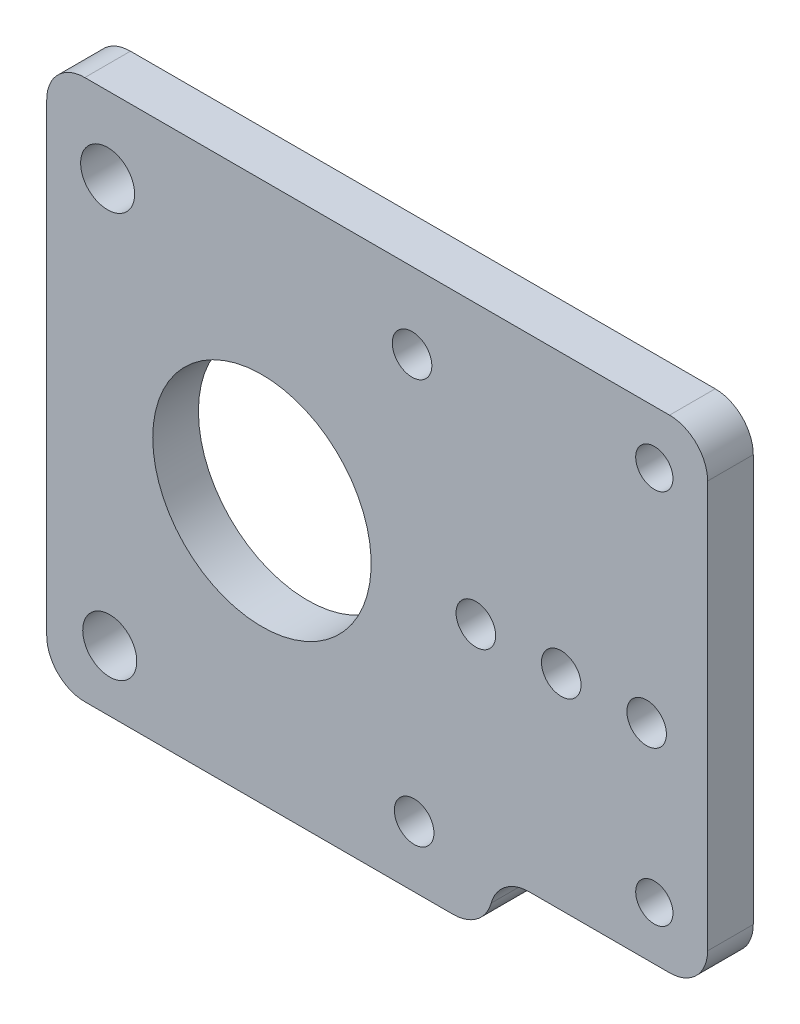
ISO-10303-21;
HEADER;
FILE_DESCRIPTION(('STEP AP214'),'2;1');
FILE_NAME('part.step','',(''),(''),'','','');
FILE_SCHEMA(('AUTOMOTIVE_DESIGN { 1 0 10303 214 1 1 1 1 }'));
ENDSEC;
DATA;
#1=APPLICATION_CONTEXT('core data for automotive mechanical design processes');
#2=APPLICATION_PROTOCOL_DEFINITION('international standard','automotive_design',2000,#1);
#3=PRODUCT_CONTEXT('',#1,'mechanical');
#4=PRODUCT('Part','Part','',(#3));
#5=PRODUCT_RELATED_PRODUCT_CATEGORY('part','',(#4));
#6=PRODUCT_DEFINITION_FORMATION('','',#4);
#7=PRODUCT_DEFINITION_CONTEXT('part definition',#1,'design');
#8=PRODUCT_DEFINITION('design','',#6,#7);
#9=PRODUCT_DEFINITION_SHAPE('','',#8);
#10=(LENGTH_UNIT() NAMED_UNIT(*) SI_UNIT(.MILLI.,.METRE.));
#11=(NAMED_UNIT(*) PLANE_ANGLE_UNIT() SI_UNIT($,.RADIAN.));
#12=(NAMED_UNIT(*) SI_UNIT($,.STERADIAN.) SOLID_ANGLE_UNIT());
#13=UNCERTAINTY_MEASURE_WITH_UNIT(LENGTH_MEASURE(1.E-05),#10,'distance_accuracy_value','');
#14=(GEOMETRIC_REPRESENTATION_CONTEXT(3) GLOBAL_UNCERTAINTY_ASSIGNED_CONTEXT((#13)) GLOBAL_UNIT_ASSIGNED_CONTEXT((#10,
#11,#12)) REPRESENTATION_CONTEXT('',''));
#15=CARTESIAN_POINT('',(0.,0.,0.));
#16=DIRECTION('',(0.,0.,1.));
#17=DIRECTION('',(1.,0.,0.));
#18=AXIS2_PLACEMENT_3D('',#15,#16,#17);
#19=CARTESIAN_POINT('',(-88.6401204237906,5.27683802928733,0.));
#20=DIRECTION('',(0.,0.,-1.));
#21=DIRECTION('',(-0.962462072065142,0.271416211446687,0.));
#22=AXIS2_PLACEMENT_3D('',#19,#20,#21);
#23=CYLINDRICAL_SURFACE('',#22,5.19500990752972);
#24=CARTESIAN_POINT('',(-88.6401204237906,5.27683802928733,0.));
#25=DIRECTION('',(0.,0.,-1.));
#26=DIRECTION('',(-0.962462072065142,0.271416211446688,0.));
#27=AXIS2_PLACEMENT_3D('',#24,#25,#26);
#28=CIRCLE('',#27,5.19500990752972);
#29=CARTESIAN_POINT('',(-93.6401204237906,6.68684793681706,0.));
#30=VERTEX_POINT('',#29);
#31=CARTESIAN_POINT('',(-88.6401204237906,10.4718479368171,0.));
#32=VERTEX_POINT('',#31);
#33=EDGE_CURVE('E278',#30,#32,#28,.T.);
#34=ORIENTED_EDGE('',*,*,#33,.T.);
#35=DIRECTION('',(0.,0.,1.));
#36=VECTOR('',#35,1.);
#37=CARTESIAN_POINT('',(-88.6401204237906,10.4718479368171,0.));
#38=LINE('',#37,#36);
#39=CARTESIAN_POINT('',(-88.6401204237906,10.4718479368171,6.));
#40=VERTEX_POINT('',#39);
#41=EDGE_CURVE('E11',#32,#40,#38,.T.);
#42=ORIENTED_EDGE('',*,*,#41,.T.);
#43=CARTESIAN_POINT('',(-88.6401204237906,5.27683802928733,6.));
#44=DIRECTION('',(0.,0.,-1.));
#45=DIRECTION('',(-0.962462072065142,0.271416211446688,0.));
#46=AXIS2_PLACEMENT_3D('',#43,#44,#45);
#47=CIRCLE('',#46,5.19500990752972);
#48=CARTESIAN_POINT('',(-93.6401204237906,6.68684793681706,6.));
#49=VERTEX_POINT('',#48);
#50=EDGE_CURVE('E257',#49,#40,#47,.T.);
#51=ORIENTED_EDGE('',*,*,#50,.F.);
#52=DIRECTION('',(0.,0.,1.));
#53=VECTOR('',#52,1.);
#54=CARTESIAN_POINT('',(-93.6401204237906,6.68684793681706,0.));
#55=LINE('',#54,#53);
#56=EDGE_CURVE('E273',#30,#49,#55,.T.);
#57=ORIENTED_EDGE('',*,*,#56,.F.);
#58=EDGE_LOOP('',(#34,#42,#51,#57));
#59=FACE_BOUND('',#58,.T.);
#60=ADVANCED_FACE('F16',(#59),#23,.F.);
#61=CARTESIAN_POINT('',(-88.6401204237906,10.4718479368171,0.));
#62=DIRECTION('',(0.,-1.,0.));
#63=DIRECTION('',(-1.,0.,0.));
#64=AXIS2_PLACEMENT_3D('',#61,#62,#63);
#65=PLANE('',#64);
#66=DIRECTION('',(1.,0.,0.));
#67=VECTOR('',#66,1.);
#68=CARTESIAN_POINT('',(-88.6401204237906,10.4718479368171,0.));
#69=LINE('',#68,#67);
#70=CARTESIAN_POINT('',(-70.2039629975671,10.4718479368171,0.));
#71=VERTEX_POINT('',#70);
#72=EDGE_CURVE('E275',#32,#71,#69,.T.);
#73=ORIENTED_EDGE('',*,*,#72,.T.);
#74=DIRECTION('',(0.,0.,1.));
#75=VECTOR('',#74,1.);
#76=CARTESIAN_POINT('',(-70.2039629975671,10.4718479368171,0.));
#77=LINE('',#76,#75);
#78=CARTESIAN_POINT('',(-70.2039629975671,10.4718479368171,6.));
#79=VERTEX_POINT('',#78);
#80=EDGE_CURVE('E27',#71,#79,#77,.T.);
#81=ORIENTED_EDGE('',*,*,#80,.T.);
#82=DIRECTION('',(1.,0.,0.));
#83=VECTOR('',#82,1.);
#84=CARTESIAN_POINT('',(-88.6401204237906,10.4718479368171,6.));
#85=LINE('',#84,#83);
#86=EDGE_CURVE('E260',#40,#79,#85,.T.);
#87=ORIENTED_EDGE('',*,*,#86,.F.);
#88=ORIENTED_EDGE('',*,*,#41,.F.);
#89=EDGE_LOOP('',(#73,#81,#87,#88));
#90=FACE_BOUND('',#89,.T.);
#91=ADVANCED_FACE('F450',(#90),#65,.T.);
#92=CARTESIAN_POINT('',(-70.2039629975671,15.4718479368171,0.));
#93=DIRECTION('',(0.,0.,1.));
#94=DIRECTION('',(0.,-1.,0.));
#95=AXIS2_PLACEMENT_3D('',#92,#93,#94);
#96=CYLINDRICAL_SURFACE('',#95,5.);
#97=CARTESIAN_POINT('',(-70.2039629975671,15.4718479368171,0.));
#98=DIRECTION('',(0.,0.,1.));
#99=DIRECTION('',(0.,-1.,0.));
#100=AXIS2_PLACEMENT_3D('',#97,#98,#99);
#101=CIRCLE('',#100,5.);
#102=CARTESIAN_POINT('',(-65.2039629975671,15.4718479368171,0.));
#103=VERTEX_POINT('',#102);
#104=EDGE_CURVE('E279',#71,#103,#101,.T.);
#105=ORIENTED_EDGE('',*,*,#104,.T.);
#106=DIRECTION('',(0.,0.,1.));
#107=VECTOR('',#106,1.);
#108=CARTESIAN_POINT('',(-65.2039629975671,15.4718479368171,0.));
#109=LINE('',#108,#107);
#110=CARTESIAN_POINT('',(-65.2039629975671,15.4718479368171,6.));
#111=VERTEX_POINT('',#110);
#112=EDGE_CURVE('E146',#103,#111,#109,.T.);
#113=ORIENTED_EDGE('',*,*,#112,.T.);
#114=CARTESIAN_POINT('',(-70.2039629975671,15.4718479368171,6.));
#115=DIRECTION('',(0.,0.,1.));
#116=DIRECTION('',(0.,-1.,0.));
#117=AXIS2_PLACEMENT_3D('',#114,#115,#116);
#118=CIRCLE('',#117,5.);
#119=EDGE_CURVE('E289',#79,#111,#118,.T.);
#120=ORIENTED_EDGE('',*,*,#119,.F.);
#121=ORIENTED_EDGE('',*,*,#80,.F.);
#122=EDGE_LOOP('',(#105,#113,#120,#121));
#123=FACE_BOUND('',#122,.T.);
#124=ADVANCED_FACE('F444',(#123),#96,.T.);
#125=CARTESIAN_POINT('',(-65.2039629975671,15.4718479368171,0.));
#126=DIRECTION('',(1.,0.,0.));
#127=DIRECTION('',(0.,-1.,0.));
#128=AXIS2_PLACEMENT_3D('',#125,#126,#127);
#129=PLANE('',#128);
#130=DIRECTION('',(0.,1.,0.));
#131=VECTOR('',#130,1.);
#132=CARTESIAN_POINT('',(-65.2039629975671,15.4718479368171,0.));
#133=LINE('',#132,#131);
#134=CARTESIAN_POINT('',(-65.2039629975671,68.9318479368171,0.));
#135=VERTEX_POINT('',#134);
#136=EDGE_CURVE('E20',#103,#135,#133,.T.);
#137=ORIENTED_EDGE('',*,*,#136,.T.);
#138=DIRECTION('',(0.,0.,1.));
#139=VECTOR('',#138,1.);
#140=CARTESIAN_POINT('',(-65.2039629975671,68.9318479368171,0.));
#141=LINE('',#140,#139);
#142=CARTESIAN_POINT('',(-65.2039629975671,68.9318479368171,6.));
#143=VERTEX_POINT('',#142);
#144=EDGE_CURVE('E134',#135,#143,#141,.T.);
#145=ORIENTED_EDGE('',*,*,#144,.T.);
#146=DIRECTION('',(0.,1.,0.));
#147=VECTOR('',#146,1.);
#148=CARTESIAN_POINT('',(-65.2039629975671,15.4718479368171,6.));
#149=LINE('',#148,#147);
#150=EDGE_CURVE('E285',#111,#143,#149,.T.);
#151=ORIENTED_EDGE('',*,*,#150,.F.);
#152=ORIENTED_EDGE('',*,*,#112,.F.);
#153=EDGE_LOOP('',(#137,#145,#151,#152));
#154=FACE_BOUND('',#153,.T.);
#155=ADVANCED_FACE('F449',(#154),#129,.T.);
#156=CARTESIAN_POINT('',(-70.2039629975671,68.9318479368171,0.));
#157=DIRECTION('',(0.,0.,1.));
#158=DIRECTION('',(1.,0.,0.));
#159=AXIS2_PLACEMENT_3D('',#156,#157,#158);
#160=CYLINDRICAL_SURFACE('',#159,5.);
#161=CARTESIAN_POINT('',(-70.2039629975671,68.9318479368171,0.));
#162=DIRECTION('',(0.,0.,1.));
#163=DIRECTION('',(1.,0.,0.));
#164=AXIS2_PLACEMENT_3D('',#161,#162,#163);
#165=CIRCLE('',#164,5.);
#166=CARTESIAN_POINT('',(-70.2039629975671,73.9318479368171,0.));
#167=VERTEX_POINT('',#166);
#168=EDGE_CURVE('E328',#135,#167,#165,.T.);
#169=ORIENTED_EDGE('',*,*,#168,.T.);
#170=DIRECTION('',(0.,0.,1.));
#171=VECTOR('',#170,1.);
#172=CARTESIAN_POINT('',(-70.2039629975671,73.9318479368171,0.));
#173=LINE('',#172,#171);
#174=CARTESIAN_POINT('',(-70.2039629975671,73.9318479368171,6.));
#175=VERTEX_POINT('',#174);
#176=EDGE_CURVE('E265',#167,#175,#173,.T.);
#177=ORIENTED_EDGE('',*,*,#176,.T.);
#178=CARTESIAN_POINT('',(-70.2039629975671,68.9318479368171,6.));
#179=DIRECTION('',(0.,0.,1.));
#180=DIRECTION('',(1.,0.,0.));
#181=AXIS2_PLACEMENT_3D('',#178,#179,#180);
#182=CIRCLE('',#181,5.);
#183=EDGE_CURVE('E288',#143,#175,#182,.T.);
#184=ORIENTED_EDGE('',*,*,#183,.F.);
#185=ORIENTED_EDGE('',*,*,#144,.F.);
#186=EDGE_LOOP('',(#169,#177,#184,#185));
#187=FACE_BOUND('',#186,.T.);
#188=ADVANCED_FACE('F496',(#187),#160,.T.);
#189=CARTESIAN_POINT('',(-70.2039629975671,73.9318479368171,0.));
#190=DIRECTION('',(0.,1.,0.));
#191=DIRECTION('',(1.,0.,0.));
#192=AXIS2_PLACEMENT_3D('',#189,#190,#191);
#193=PLANE('',#192);
#194=DIRECTION('',(-1.,0.,0.));
#195=VECTOR('',#194,1.);
#196=CARTESIAN_POINT('',(-70.2039629975671,73.9318479368171,0.));
#197=LINE('',#196,#195);
#198=CARTESIAN_POINT('',(-147.037894963746,73.9318479368171,0.));
#199=VERTEX_POINT('',#198);
#200=EDGE_CURVE('E332',#167,#199,#197,.T.);
#201=ORIENTED_EDGE('',*,*,#200,.T.);
#202=DIRECTION('',(0.,0.,1.));
#203=VECTOR('',#202,1.);
#204=CARTESIAN_POINT('',(-147.037894963746,73.9318479368171,0.));
#205=LINE('',#204,#203);
#206=CARTESIAN_POINT('',(-147.037894963746,73.9318479368171,6.));
#207=VERTEX_POINT('',#206);
#208=EDGE_CURVE('E262',#199,#207,#205,.T.);
#209=ORIENTED_EDGE('',*,*,#208,.T.);
#210=DIRECTION('',(-1.,0.,0.));
#211=VECTOR('',#210,1.);
#212=CARTESIAN_POINT('',(-70.2039629975671,73.9318479368171,6.));
#213=LINE('',#212,#211);
#214=EDGE_CURVE('E235',#175,#207,#213,.T.);
#215=ORIENTED_EDGE('',*,*,#214,.F.);
#216=ORIENTED_EDGE('',*,*,#176,.F.);
#217=EDGE_LOOP('',(#201,#209,#215,#216));
#218=FACE_BOUND('',#217,.T.);
#219=ADVANCED_FACE('F18',(#218),#193,.T.);
#220=CARTESIAN_POINT('',(-147.037894963746,68.9318479368171,0.));
#221=DIRECTION('',(0.,0.,1.));
#222=DIRECTION('',(0.,1.,0.));
#223=AXIS2_PLACEMENT_3D('',#220,#221,#222);
#224=CYLINDRICAL_SURFACE('',#223,5.);
#225=CARTESIAN_POINT('',(-147.037894963746,68.9318479368171,0.));
#226=DIRECTION('',(0.,0.,1.));
#227=DIRECTION('',(0.,1.,0.));
#228=AXIS2_PLACEMENT_3D('',#225,#226,#227);
#229=CIRCLE('',#228,5.);
#230=CARTESIAN_POINT('',(-152.037894963746,68.9318479368171,0.));
#231=VERTEX_POINT('',#230);
#232=EDGE_CURVE('E313',#199,#231,#229,.T.);
#233=ORIENTED_EDGE('',*,*,#232,.T.);
#234=DIRECTION('',(0.,0.,1.));
#235=VECTOR('',#234,1.);
#236=CARTESIAN_POINT('',(-152.037894963746,68.9318479368171,0.));
#237=LINE('',#236,#235);
#238=CARTESIAN_POINT('',(-152.037894963746,68.9318479368171,6.));
#239=VERTEX_POINT('',#238);
#240=EDGE_CURVE('E212',#231,#239,#237,.T.);
#241=ORIENTED_EDGE('',*,*,#240,.T.);
#242=CARTESIAN_POINT('',(-147.037894963746,68.9318479368171,6.));
#243=DIRECTION('',(0.,0.,1.));
#244=DIRECTION('',(0.,1.,0.));
#245=AXIS2_PLACEMENT_3D('',#242,#243,#244);
#246=CIRCLE('',#245,5.);
#247=EDGE_CURVE('E228',#207,#239,#246,.T.);
#248=ORIENTED_EDGE('',*,*,#247,.F.);
#249=ORIENTED_EDGE('',*,*,#208,.F.);
#250=EDGE_LOOP('',(#233,#241,#248,#249));
#251=FACE_BOUND('',#250,.T.);
#252=ADVANCED_FACE('F563',(#251),#224,.T.);
#253=CARTESIAN_POINT('',(-152.037894963746,68.9318479368171,0.));
#254=DIRECTION('',(-1.,0.,0.));
#255=DIRECTION('',(0.,0.,1.));
#256=AXIS2_PLACEMENT_3D('',#253,#254,#255);
#257=PLANE('',#256);
#258=DIRECTION('',(0.,-1.,0.));
#259=VECTOR('',#258,1.);
#260=CARTESIAN_POINT('',(-152.037894963746,68.9318479368171,0.));
#261=LINE('',#260,#259);
#262=CARTESIAN_POINT('',(-152.037894963746,7.90184793681706,0.));
#263=VERTEX_POINT('',#262);
#264=EDGE_CURVE('E207',#231,#263,#261,.T.);
#265=ORIENTED_EDGE('',*,*,#264,.T.);
#266=DIRECTION('',(0.,0.,1.));
#267=VECTOR('',#266,1.);
#268=CARTESIAN_POINT('',(-152.037894963746,7.90184793681706,0.));
#269=LINE('',#268,#267);
#270=CARTESIAN_POINT('',(-152.037894963746,7.90184793681706,6.));
#271=VERTEX_POINT('',#270);
#272=EDGE_CURVE('E200',#263,#271,#269,.T.);
#273=ORIENTED_EDGE('',*,*,#272,.T.);
#274=DIRECTION('',(0.,-1.,0.));
#275=VECTOR('',#274,1.);
#276=CARTESIAN_POINT('',(-152.037894963746,68.9318479368171,6.));
#277=LINE('',#276,#275);
#278=EDGE_CURVE('E204',#239,#271,#277,.T.);
#279=ORIENTED_EDGE('',*,*,#278,.F.);
#280=ORIENTED_EDGE('',*,*,#240,.F.);
#281=EDGE_LOOP('',(#265,#273,#279,#280));
#282=FACE_BOUND('',#281,.T.);
#283=ADVANCED_FACE('F202',(#282),#257,.T.);
#284=CARTESIAN_POINT('',(-147.037894963746,7.90184793681707,0.));
#285=DIRECTION('',(0.,0.,1.));
#286=DIRECTION('',(-1.,0.,0.));
#287=AXIS2_PLACEMENT_3D('',#284,#285,#286);
#288=CYLINDRICAL_SURFACE('',#287,5.);
#289=CARTESIAN_POINT('',(-147.037894963746,7.90184793681707,0.));
#290=DIRECTION('',(0.,0.,1.));
#291=DIRECTION('',(-1.,0.,0.));
#292=AXIS2_PLACEMENT_3D('',#289,#290,#291);
#293=CIRCLE('',#292,5.);
#294=CARTESIAN_POINT('',(-147.037894963746,2.90184793681706,0.));
#295=VERTEX_POINT('',#294);
#296=EDGE_CURVE('E249',#263,#295,#293,.T.);
#297=ORIENTED_EDGE('',*,*,#296,.T.);
#298=DIRECTION('',(0.,0.,1.));
#299=VECTOR('',#298,1.);
#300=CARTESIAN_POINT('',(-147.037894963746,2.90184793681706,0.));
#301=LINE('',#300,#299);
#302=CARTESIAN_POINT('',(-147.037894963746,2.90184793681706,6.));
#303=VERTEX_POINT('',#302);
#304=EDGE_CURVE('E213',#295,#303,#301,.T.);
#305=ORIENTED_EDGE('',*,*,#304,.T.);
#306=CARTESIAN_POINT('',(-147.037894963746,7.90184793681707,6.));
#307=DIRECTION('',(0.,0.,1.));
#308=DIRECTION('',(-1.,0.,0.));
#309=AXIS2_PLACEMENT_3D('',#306,#307,#308);
#310=CIRCLE('',#309,5.);
#311=EDGE_CURVE('E216',#271,#303,#310,.T.);
#312=ORIENTED_EDGE('',*,*,#311,.F.);
#313=ORIENTED_EDGE('',*,*,#272,.F.);
#314=EDGE_LOOP('',(#297,#305,#312,#313));
#315=FACE_BOUND('',#314,.T.);
#316=ADVANCED_FACE('F217',(#315),#288,.T.);
#317=CARTESIAN_POINT('',(-147.037894963746,2.90184793681706,0.));
#318=DIRECTION('',(0.,-1.,0.));
#319=DIRECTION('',(-1.,0.,0.));
#320=AXIS2_PLACEMENT_3D('',#317,#318,#319);
#321=PLANE('',#320);
#322=DIRECTION('',(1.,0.,0.));
#323=VECTOR('',#322,1.);
#324=CARTESIAN_POINT('',(-147.037894963746,2.90184793681706,0.));
#325=LINE('',#324,#323);
#326=CARTESIAN_POINT('',(-98.6401204237907,2.90184793681706,0.));
#327=VERTEX_POINT('',#326);
#328=EDGE_CURVE('E245',#295,#327,#325,.T.);
#329=ORIENTED_EDGE('',*,*,#328,.T.);
#330=DIRECTION('',(0.,0.,1.));
#331=VECTOR('',#330,1.);
#332=CARTESIAN_POINT('',(-98.6401204237907,2.90184793681706,0.));
#333=LINE('',#332,#331);
#334=CARTESIAN_POINT('',(-98.6401204237907,2.90184793681706,6.));
#335=VERTEX_POINT('',#334);
#336=EDGE_CURVE('E366',#327,#335,#333,.T.);
#337=ORIENTED_EDGE('',*,*,#336,.T.);
#338=DIRECTION('',(1.,0.,0.));
#339=VECTOR('',#338,1.);
#340=CARTESIAN_POINT('',(-147.037894963746,2.90184793681706,6.));
#341=LINE('',#340,#339);
#342=EDGE_CURVE('E222',#303,#335,#341,.T.);
#343=ORIENTED_EDGE('',*,*,#342,.F.);
#344=ORIENTED_EDGE('',*,*,#304,.F.);
#345=EDGE_LOOP('',(#329,#337,#343,#344));
#346=FACE_BOUND('',#345,.T.);
#347=ADVANCED_FACE('F532',(#346),#321,.T.);
#348=CARTESIAN_POINT('',(-98.6401204237907,8.0968578443468,0.));
#349=DIRECTION('',(0.,0.,1.));
#350=DIRECTION('',(0.,-1.,0.));
#351=AXIS2_PLACEMENT_3D('',#348,#349,#350);
#352=CYLINDRICAL_SURFACE('',#351,5.19500990752974);
#353=CARTESIAN_POINT('',(-98.6401204237907,8.0968578443468,0.));
#354=DIRECTION('',(0.,0.,1.));
#355=DIRECTION('',(0.,-1.,0.));
#356=AXIS2_PLACEMENT_3D('',#353,#354,#355);
#357=CIRCLE('',#356,5.19500990752974);
#358=EDGE_CURVE('E250',#327,#30,#357,.T.);
#359=ORIENTED_EDGE('',*,*,#358,.T.);
#360=ORIENTED_EDGE('',*,*,#56,.T.);
#361=CARTESIAN_POINT('',(-98.6401204237907,8.0968578443468,6.));
#362=DIRECTION('',(0.,0.,1.));
#363=DIRECTION('',(0.,-1.,0.));
#364=AXIS2_PLACEMENT_3D('',#361,#362,#363);
#365=CIRCLE('',#364,5.19500990752974);
#366=EDGE_CURVE('E270',#335,#49,#365,.T.);
#367=ORIENTED_EDGE('',*,*,#366,.F.);
#368=ORIENTED_EDGE('',*,*,#336,.F.);
#369=EDGE_LOOP('',(#359,#360,#367,#368));
#370=FACE_BOUND('',#369,.T.);
#371=ADVANCED_FACE('F526',(#370),#352,.T.);
#372=CARTESIAN_POINT('',(-123.760120423791,37.4218479368171,0.));
#373=DIRECTION('',(0.,0.,1.));
#374=DIRECTION('',(-1.,0.,0.));
#375=AXIS2_PLACEMENT_3D('',#372,#373,#374);
#376=CYLINDRICAL_SURFACE('',#375,14.35);
#377=CARTESIAN_POINT('',(-123.760120423791,37.4218479368171,6.));
#378=DIRECTION('',(0.,0.,-1.));
#379=DIRECTION('',(-1.,0.,0.));
#380=AXIS2_PLACEMENT_3D('',#377,#378,#379);
#381=CIRCLE('',#380,14.35);
#382=CARTESIAN_POINT('',(-138.110120423791,37.4218479368171,6.));
#383=VERTEX_POINT('',#382);
#384=EDGE_CURVE('E307',#383,#383,#381,.T.);
#385=ORIENTED_EDGE('',*,*,#384,.F.);
#386=EDGE_LOOP('',(#385));
#387=FACE_BOUND('',#386,.T.);
#388=CARTESIAN_POINT('',(-123.760120423791,37.4218479368171,0.));
#389=DIRECTION('',(0.,0.,1.));
#390=DIRECTION('',(-1.,0.,0.));
#391=AXIS2_PLACEMENT_3D('',#388,#389,#390);
#392=CIRCLE('',#391,14.35);
#393=CARTESIAN_POINT('',(-138.110120423791,37.4218479368171,0.));
#394=VERTEX_POINT('',#393);
#395=EDGE_CURVE('E284',#394,#394,#392,.T.);
#396=ORIENTED_EDGE('',*,*,#395,.F.);
#397=EDGE_LOOP('',(#396));
#398=FACE_BOUND('',#397,.T.);
#399=ADVANCED_FACE('F531',(#387,#398),#376,.F.);
#400=CARTESIAN_POINT('',(-143.760120423791,10.9018479368171,0.));
#401=DIRECTION('',(0.,0.,1.));
#402=DIRECTION('',(-1.,0.,0.));
#403=AXIS2_PLACEMENT_3D('',#400,#401,#402);
#404=CYLINDRICAL_SURFACE('',#403,3.55);
#405=CARTESIAN_POINT('',(-143.760120423791,10.9018479368171,6.));
#406=DIRECTION('',(0.,0.,-1.));
#407=DIRECTION('',(-1.,0.,0.));
#408=AXIS2_PLACEMENT_3D('',#405,#406,#407);
#409=CIRCLE('',#408,3.55);
#410=CARTESIAN_POINT('',(-147.310120423791,10.9018479368171,6.));
#411=VERTEX_POINT('',#410);
#412=EDGE_CURVE('E310',#411,#411,#409,.T.);
#413=ORIENTED_EDGE('',*,*,#412,.F.);
#414=EDGE_LOOP('',(#413));
#415=FACE_BOUND('',#414,.T.);
#416=CARTESIAN_POINT('',(-143.760120423791,10.9018479368171,0.));
#417=DIRECTION('',(0.,0.,1.));
#418=DIRECTION('',(-1.,0.,0.));
#419=AXIS2_PLACEMENT_3D('',#416,#417,#418);
#420=CIRCLE('',#419,3.55);
#421=CARTESIAN_POINT('',(-147.310120423791,10.9018479368171,0.));
#422=VERTEX_POINT('',#421);
#423=EDGE_CURVE('E301',#422,#422,#420,.T.);
#424=ORIENTED_EDGE('',*,*,#423,.F.);
#425=EDGE_LOOP('',(#424));
#426=FACE_BOUND('',#425,.T.);
#427=ADVANCED_FACE('F542',(#415,#426),#404,.F.);
#428=CARTESIAN_POINT('',(-144.037894963746,63.9312892910639,0.));
#429=DIRECTION('',(0.,0.,1.));
#430=DIRECTION('',(-1.,0.,0.));
#431=AXIS2_PLACEMENT_3D('',#428,#429,#430);
#432=CYLINDRICAL_SURFACE('',#431,3.55);
#433=CARTESIAN_POINT('',(-144.037894963746,63.9312892910639,6.));
#434=DIRECTION('',(0.,0.,-1.));
#435=DIRECTION('',(-1.,0.,0.));
#436=AXIS2_PLACEMENT_3D('',#433,#434,#435);
#437=CIRCLE('',#436,3.55);
#438=CARTESIAN_POINT('',(-147.587894963746,63.9312892910639,6.));
#439=VERTEX_POINT('',#438);
#440=EDGE_CURVE('E321',#439,#439,#437,.T.);
#441=ORIENTED_EDGE('',*,*,#440,.F.);
#442=EDGE_LOOP('',(#441));
#443=FACE_BOUND('',#442,.T.);
#444=CARTESIAN_POINT('',(-144.037894963746,63.9312892910639,0.));
#445=DIRECTION('',(0.,0.,1.));
#446=DIRECTION('',(-1.,0.,0.));
#447=AXIS2_PLACEMENT_3D('',#444,#445,#446);
#448=CIRCLE('',#447,3.55);
#449=CARTESIAN_POINT('',(-147.587894963746,63.9312892910639,0.));
#450=VERTEX_POINT('',#449);
#451=EDGE_CURVE('E306',#450,#450,#448,.T.);
#452=ORIENTED_EDGE('',*,*,#451,.F.);
#453=EDGE_LOOP('',(#452));
#454=FACE_BOUND('',#453,.T.);
#455=ADVANCED_FACE('F478',(#443,#454),#432,.F.);
#456=CARTESIAN_POINT('',(-95.6539629975671,37.4112892910639,0.));
#457=DIRECTION('',(0.,0.,1.));
#458=DIRECTION('',(-1.,0.,0.));
#459=AXIS2_PLACEMENT_3D('',#456,#457,#458);
#460=CYLINDRICAL_SURFACE('',#459,2.6);
#461=CARTESIAN_POINT('',(-95.6539629975671,37.4112892910639,6.));
#462=DIRECTION('',(0.,0.,-1.));
#463=DIRECTION('',(-1.,0.,0.));
#464=AXIS2_PLACEMENT_3D('',#461,#462,#463);
#465=CIRCLE('',#464,2.6);
#466=CARTESIAN_POINT('',(-98.2539629975671,37.4112892910639,6.));
#467=VERTEX_POINT('',#466);
#468=EDGE_CURVE('E244',#467,#467,#465,.T.);
#469=ORIENTED_EDGE('',*,*,#468,.F.);
#470=EDGE_LOOP('',(#469));
#471=FACE_BOUND('',#470,.T.);
#472=CARTESIAN_POINT('',(-95.6539629975671,37.4112892910639,0.));
#473=DIRECTION('',(0.,0.,1.));
#474=DIRECTION('',(-1.,0.,0.));
#475=AXIS2_PLACEMENT_3D('',#472,#473,#474);
#476=CIRCLE('',#475,2.6);
#477=CARTESIAN_POINT('',(-98.2539629975671,37.4112892910639,0.));
#478=VERTEX_POINT('',#477);
#479=EDGE_CURVE('E256',#478,#478,#476,.T.);
#480=ORIENTED_EDGE('',*,*,#479,.F.);
#481=EDGE_LOOP('',(#480));
#482=FACE_BOUND('',#481,.T.);
#483=ADVANCED_FACE('F472',(#471,#482),#460,.F.);
#484=CARTESIAN_POINT('',(-84.4339629975671,37.4112892910639,0.));
#485=DIRECTION('',(0.,0.,1.));
#486=DIRECTION('',(-1.,0.,0.));
#487=AXIS2_PLACEMENT_3D('',#484,#485,#486);
#488=CYLINDRICAL_SURFACE('',#487,2.6);
#489=CARTESIAN_POINT('',(-84.4339629975671,37.4112892910639,6.));
#490=DIRECTION('',(0.,0.,-1.));
#491=DIRECTION('',(-1.,0.,0.));
#492=AXIS2_PLACEMENT_3D('',#489,#490,#491);
#493=CIRCLE('',#492,2.6);
#494=CARTESIAN_POINT('',(-87.0339629975671,37.4112892910639,6.));
#495=VERTEX_POINT('',#494);
#496=EDGE_CURVE('E240',#495,#495,#493,.T.);
#497=ORIENTED_EDGE('',*,*,#496,.F.);
#498=EDGE_LOOP('',(#497));
#499=FACE_BOUND('',#498,.T.);
#500=CARTESIAN_POINT('',(-84.4339629975671,37.4112892910639,0.));
#501=DIRECTION('',(0.,0.,1.));
#502=DIRECTION('',(-1.,0.,0.));
#503=AXIS2_PLACEMENT_3D('',#500,#501,#502);
#504=CIRCLE('',#503,2.6);
#505=CARTESIAN_POINT('',(-87.0339629975671,37.4112892910639,0.));
#506=VERTEX_POINT('',#505);
#507=EDGE_CURVE('E251',#506,#506,#504,.T.);
#508=ORIENTED_EDGE('',*,*,#507,.F.);
#509=EDGE_LOOP('',(#508));
#510=FACE_BOUND('',#509,.T.);
#511=ADVANCED_FACE('F477',(#499,#510),#488,.F.);
#512=CARTESIAN_POINT('',(-73.2139629975671,37.4112892910639,0.));
#513=DIRECTION('',(0.,0.,1.));
#514=DIRECTION('',(-1.,0.,0.));
#515=AXIS2_PLACEMENT_3D('',#512,#513,#514);
#516=CYLINDRICAL_SURFACE('',#515,2.6);
#517=CARTESIAN_POINT('',(-73.2139629975671,37.4112892910639,6.));
#518=DIRECTION('',(0.,0.,-1.));
#519=DIRECTION('',(-1.,0.,0.));
#520=AXIS2_PLACEMENT_3D('',#517,#518,#519);
#521=CIRCLE('',#520,2.6);
#522=CARTESIAN_POINT('',(-75.8139629975671,37.4112892910639,6.));
#523=VERTEX_POINT('',#522);
#524=EDGE_CURVE('E243',#523,#523,#521,.T.);
#525=ORIENTED_EDGE('',*,*,#524,.F.);
#526=EDGE_LOOP('',(#525));
#527=FACE_BOUND('',#526,.T.);
#528=CARTESIAN_POINT('',(-73.2139629975671,37.4112892910639,0.));
#529=DIRECTION('',(0.,0.,1.));
#530=DIRECTION('',(-1.,0.,0.));
#531=AXIS2_PLACEMENT_3D('',#528,#529,#530);
#532=CIRCLE('',#531,2.6);
#533=CARTESIAN_POINT('',(-75.8139629975671,37.4112892910639,0.));
#534=VERTEX_POINT('',#533);
#535=EDGE_CURVE('E255',#534,#534,#532,.T.);
#536=ORIENTED_EDGE('',*,*,#535,.F.);
#537=EDGE_LOOP('',(#536));
#538=FACE_BOUND('',#537,.T.);
#539=ADVANCED_FACE('F490',(#527,#538),#516,.F.);
#540=CARTESIAN_POINT('',(-103.760120423791,10.9018479368171,0.));
#541=DIRECTION('',(0.,0.,1.));
#542=DIRECTION('',(-1.,0.,0.));
#543=AXIS2_PLACEMENT_3D('',#540,#541,#542);
#544=CYLINDRICAL_SURFACE('',#543,2.6);
#545=CARTESIAN_POINT('',(-103.760120423791,10.9018479368171,6.));
#546=DIRECTION('',(0.,0.,-1.));
#547=DIRECTION('',(-1.,0.,0.));
#548=AXIS2_PLACEMENT_3D('',#545,#546,#547);
#549=CIRCLE('',#548,2.6);
#550=CARTESIAN_POINT('',(-106.360120423791,10.9018479368171,6.));
#551=VERTEX_POINT('',#550);
#552=EDGE_CURVE('E325',#551,#551,#549,.T.);
#553=ORIENTED_EDGE('',*,*,#552,.F.);
#554=EDGE_LOOP('',(#553));
#555=FACE_BOUND('',#554,.T.);
#556=CARTESIAN_POINT('',(-103.760120423791,10.9018479368171,0.));
#557=DIRECTION('',(0.,0.,1.));
#558=DIRECTION('',(-1.,0.,0.));
#559=AXIS2_PLACEMENT_3D('',#556,#557,#558);
#560=CIRCLE('',#559,2.6);
#561=CARTESIAN_POINT('',(-106.360120423791,10.9018479368171,0.));
#562=VERTEX_POINT('',#561);
#563=EDGE_CURVE('E295',#562,#562,#560,.T.);
#564=ORIENTED_EDGE('',*,*,#563,.F.);
#565=EDGE_LOOP('',(#564));
#566=FACE_BOUND('',#565,.T.);
#567=ADVANCED_FACE('F485',(#555,#566),#544,.F.);
#568=CARTESIAN_POINT('',(-104.037894963746,63.9312892910639,0.));
#569=DIRECTION('',(0.,0.,1.));
#570=DIRECTION('',(-1.,0.,0.));
#571=AXIS2_PLACEMENT_3D('',#568,#569,#570);
#572=CYLINDRICAL_SURFACE('',#571,2.6);
#573=CARTESIAN_POINT('',(-104.037894963746,63.9312892910639,6.));
#574=DIRECTION('',(0.,0.,-1.));
#575=DIRECTION('',(-1.,0.,0.));
#576=AXIS2_PLACEMENT_3D('',#573,#574,#575);
#577=CIRCLE('',#576,2.6);
#578=CARTESIAN_POINT('',(-106.637894963746,63.9312892910639,6.));
#579=VERTEX_POINT('',#578);
#580=EDGE_CURVE('E340',#579,#579,#577,.T.);
#581=ORIENTED_EDGE('',*,*,#580,.F.);
#582=EDGE_LOOP('',(#581));
#583=FACE_BOUND('',#582,.T.);
#584=CARTESIAN_POINT('',(-104.037894963746,63.9312892910639,0.));
#585=DIRECTION('',(0.,0.,1.));
#586=DIRECTION('',(-1.,0.,0.));
#587=AXIS2_PLACEMENT_3D('',#584,#585,#586);
#588=CIRCLE('',#587,2.6);
#589=CARTESIAN_POINT('',(-106.637894963746,63.9312892910639,0.));
#590=VERTEX_POINT('',#589);
#591=EDGE_CURVE('E291',#590,#590,#588,.T.);
#592=ORIENTED_EDGE('',*,*,#591,.F.);
#593=EDGE_LOOP('',(#592));
#594=FACE_BOUND('',#593,.T.);
#595=ADVANCED_FACE('F437',(#583,#594),#572,.F.);
#596=CARTESIAN_POINT('',(-72.2039629975671,66.9318479368171,0.));
#597=DIRECTION('',(0.,0.,1.));
#598=DIRECTION('',(-1.,0.,0.));
#599=AXIS2_PLACEMENT_3D('',#596,#597,#598);
#600=CYLINDRICAL_SURFACE('',#599,2.45);
#601=CARTESIAN_POINT('',(-72.2039629975671,66.9318479368171,6.));
#602=DIRECTION('',(0.,0.,-1.));
#603=DIRECTION('',(-1.,0.,0.));
#604=AXIS2_PLACEMENT_3D('',#601,#602,#603);
#605=CIRCLE('',#604,2.45);
#606=CARTESIAN_POINT('',(-74.6539629975671,66.9318479368171,6.));
#607=VERTEX_POINT('',#606);
#608=EDGE_CURVE('E274',#607,#607,#605,.T.);
#609=ORIENTED_EDGE('',*,*,#608,.F.);
#610=EDGE_LOOP('',(#609));
#611=FACE_BOUND('',#610,.T.);
#612=CARTESIAN_POINT('',(-72.2039629975671,66.9318479368171,0.));
#613=DIRECTION('',(0.,0.,1.));
#614=DIRECTION('',(-1.,0.,0.));
#615=AXIS2_PLACEMENT_3D('',#612,#613,#614);
#616=CIRCLE('',#615,2.45);
#617=CARTESIAN_POINT('',(-74.6539629975671,66.9318479368171,0.));
#618=VERTEX_POINT('',#617);
#619=EDGE_CURVE('E294',#618,#618,#616,.T.);
#620=ORIENTED_EDGE('',*,*,#619,.F.);
#621=EDGE_LOOP('',(#620));
#622=FACE_BOUND('',#621,.T.);
#623=ADVANCED_FACE('F431',(#611,#622),#600,.F.);
#624=CARTESIAN_POINT('',(-72.2039629975671,17.4718479368171,0.));
#625=DIRECTION('',(0.,0.,1.));
#626=DIRECTION('',(-1.,0.,0.));
#627=AXIS2_PLACEMENT_3D('',#624,#625,#626);
#628=CYLINDRICAL_SURFACE('',#627,2.45);
#629=CARTESIAN_POINT('',(-72.2039629975671,17.4718479368171,6.));
#630=DIRECTION('',(0.,0.,-1.));
#631=DIRECTION('',(-1.,0.,0.));
#632=AXIS2_PLACEMENT_3D('',#629,#630,#631);
#633=CIRCLE('',#632,2.45);
#634=CARTESIAN_POINT('',(-74.6539629975671,17.4718479368171,6.));
#635=VERTEX_POINT('',#634);
#636=EDGE_CURVE('E39',#635,#635,#633,.T.);
#637=ORIENTED_EDGE('',*,*,#636,.F.);
#638=EDGE_LOOP('',(#637));
#639=FACE_BOUND('',#638,.T.);
#640=CARTESIAN_POINT('',(-72.2039629975671,17.4718479368171,0.));
#641=DIRECTION('',(0.,0.,1.));
#642=DIRECTION('',(-1.,0.,0.));
#643=AXIS2_PLACEMENT_3D('',#640,#641,#642);
#644=CIRCLE('',#643,2.45);
#645=CARTESIAN_POINT('',(-74.6539629975671,17.4718479368171,0.));
#646=VERTEX_POINT('',#645);
#647=EDGE_CURVE('E261',#646,#646,#644,.T.);
#648=ORIENTED_EDGE('',*,*,#647,.F.);
#649=EDGE_LOOP('',(#648));
#650=FACE_BOUND('',#649,.T.);
#651=ADVANCED_FACE('F436',(#639,#650),#628,.F.);
#652=CARTESIAN_POINT('',(0.,0.,6.));
#653=DIRECTION('',(0.,0.,1.));
#654=DIRECTION('',(1.,0.,0.));
#655=AXIS2_PLACEMENT_3D('',#652,#653,#654);
#656=PLANE('',#655);
#657=ORIENTED_EDGE('',*,*,#636,.T.);
#658=EDGE_LOOP('',(#657));
#659=FACE_BOUND('',#658,.T.);
#660=ORIENTED_EDGE('',*,*,#608,.T.);
#661=EDGE_LOOP('',(#660));
#662=FACE_BOUND('',#661,.T.);
#663=ORIENTED_EDGE('',*,*,#580,.T.);
#664=EDGE_LOOP('',(#663));
#665=FACE_BOUND('',#664,.T.);
#666=ORIENTED_EDGE('',*,*,#552,.T.);
#667=EDGE_LOOP('',(#666));
#668=FACE_BOUND('',#667,.T.);
#669=ORIENTED_EDGE('',*,*,#524,.T.);
#670=EDGE_LOOP('',(#669));
#671=FACE_BOUND('',#670,.T.);
#672=ORIENTED_EDGE('',*,*,#496,.T.);
#673=EDGE_LOOP('',(#672));
#674=FACE_BOUND('',#673,.T.);
#675=ORIENTED_EDGE('',*,*,#468,.T.);
#676=EDGE_LOOP('',(#675));
#677=FACE_BOUND('',#676,.T.);
#678=ORIENTED_EDGE('',*,*,#440,.T.);
#679=EDGE_LOOP('',(#678));
#680=FACE_BOUND('',#679,.T.);
#681=ORIENTED_EDGE('',*,*,#412,.T.);
#682=EDGE_LOOP('',(#681));
#683=FACE_BOUND('',#682,.T.);
#684=ORIENTED_EDGE('',*,*,#384,.T.);
#685=EDGE_LOOP('',(#684));
#686=FACE_BOUND('',#685,.T.);
#687=ORIENTED_EDGE('',*,*,#50,.T.);
#688=ORIENTED_EDGE('',*,*,#86,.T.);
#689=ORIENTED_EDGE('',*,*,#119,.T.);
#690=ORIENTED_EDGE('',*,*,#150,.T.);
#691=ORIENTED_EDGE('',*,*,#183,.T.);
#692=ORIENTED_EDGE('',*,*,#214,.T.);
#693=ORIENTED_EDGE('',*,*,#247,.T.);
#694=ORIENTED_EDGE('',*,*,#278,.T.);
#695=ORIENTED_EDGE('',*,*,#311,.T.);
#696=ORIENTED_EDGE('',*,*,#342,.T.);
#697=ORIENTED_EDGE('',*,*,#366,.T.);
#698=EDGE_LOOP('',(#687,#688,#689,#690,#691,#692,#693,#694,#695,#696,#697));
#699=FACE_BOUND('',#698,.T.);
#700=ADVANCED_FACE('F225',(#659,#662,#665,#668,#671,#674,#677,#680,#683,#686,#699),#656,.T.);
#701=CARTESIAN_POINT('',(0.,0.,0.));
#702=DIRECTION('',(0.,0.,1.));
#703=DIRECTION('',(1.,0.,0.));
#704=AXIS2_PLACEMENT_3D('',#701,#702,#703);
#705=PLANE('',#704);
#706=ORIENTED_EDGE('',*,*,#647,.T.);
#707=EDGE_LOOP('',(#706));
#708=FACE_BOUND('',#707,.T.);
#709=ORIENTED_EDGE('',*,*,#619,.T.);
#710=EDGE_LOOP('',(#709));
#711=FACE_BOUND('',#710,.T.);
#712=ORIENTED_EDGE('',*,*,#591,.T.);
#713=EDGE_LOOP('',(#712));
#714=FACE_BOUND('',#713,.T.);
#715=ORIENTED_EDGE('',*,*,#563,.T.);
#716=EDGE_LOOP('',(#715));
#717=FACE_BOUND('',#716,.T.);
#718=ORIENTED_EDGE('',*,*,#535,.T.);
#719=EDGE_LOOP('',(#718));
#720=FACE_BOUND('',#719,.T.);
#721=ORIENTED_EDGE('',*,*,#507,.T.);
#722=EDGE_LOOP('',(#721));
#723=FACE_BOUND('',#722,.T.);
#724=ORIENTED_EDGE('',*,*,#479,.T.);
#725=EDGE_LOOP('',(#724));
#726=FACE_BOUND('',#725,.T.);
#727=ORIENTED_EDGE('',*,*,#451,.T.);
#728=EDGE_LOOP('',(#727));
#729=FACE_BOUND('',#728,.T.);
#730=ORIENTED_EDGE('',*,*,#423,.T.);
#731=EDGE_LOOP('',(#730));
#732=FACE_BOUND('',#731,.T.);
#733=ORIENTED_EDGE('',*,*,#395,.T.);
#734=EDGE_LOOP('',(#733));
#735=FACE_BOUND('',#734,.T.);
#736=ORIENTED_EDGE('',*,*,#358,.F.);
#737=ORIENTED_EDGE('',*,*,#328,.F.);
#738=ORIENTED_EDGE('',*,*,#296,.F.);
#739=ORIENTED_EDGE('',*,*,#264,.F.);
#740=ORIENTED_EDGE('',*,*,#232,.F.);
#741=ORIENTED_EDGE('',*,*,#200,.F.);
#742=ORIENTED_EDGE('',*,*,#168,.F.);
#743=ORIENTED_EDGE('',*,*,#136,.F.);
#744=ORIENTED_EDGE('',*,*,#104,.F.);
#745=ORIENTED_EDGE('',*,*,#72,.F.);
#746=ORIENTED_EDGE('',*,*,#33,.F.);
#747=EDGE_LOOP('',(#736,#737,#738,#739,#740,#741,#742,#743,#744,#745,#746));
#748=FACE_BOUND('',#747,.T.);
#749=ADVANCED_FACE('F460',(#708,#711,#714,#717,#720,#723,#726,#729,#732,#735,#748),#705,.F.);
#750=CLOSED_SHELL('',(#60,#91,#124,#155,#188,#219,#252,#283,#316,#347,#371,#399,#427,#455,#483,
#511,#539,#567,#595,#623,#651,#700,#749));
#751=MANIFOLD_SOLID_BREP('B1',#750);
#752=ADVANCED_BREP_SHAPE_REPRESENTATION('',(#18,#751),#14);
#753=SHAPE_DEFINITION_REPRESENTATION(#9,#752);
ENDSEC;
END-ISO-10303-21;
